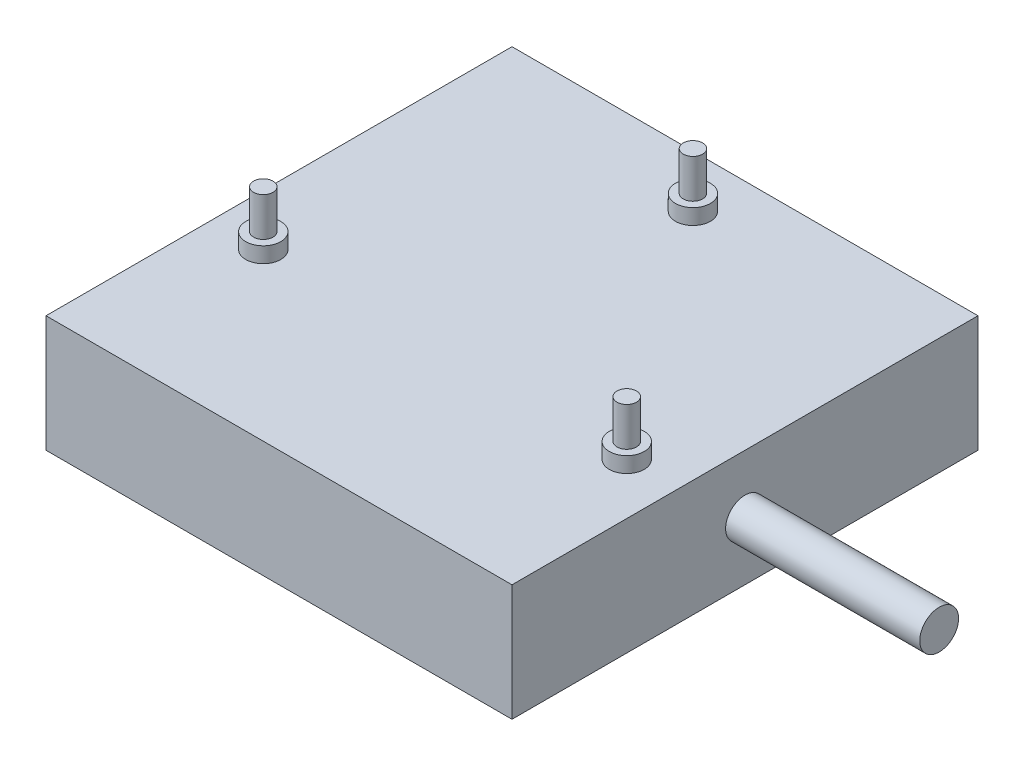
ISO-10303-21;
HEADER;
FILE_DESCRIPTION(('STEP AP214'),'2;1');
FILE_NAME('part.step','',(''),(''),'','','');
FILE_SCHEMA(('AUTOMOTIVE_DESIGN { 1 0 10303 214 1 1 1 1 }'));
ENDSEC;
DATA;
#1=APPLICATION_CONTEXT('core data for automotive mechanical design processes');
#2=APPLICATION_PROTOCOL_DEFINITION('international standard','automotive_design',2000,#1);
#3=PRODUCT_CONTEXT('',#1,'mechanical');
#4=PRODUCT('Part','Part','',(#3));
#5=PRODUCT_RELATED_PRODUCT_CATEGORY('part','',(#4));
#6=PRODUCT_DEFINITION_FORMATION('','',#4);
#7=PRODUCT_DEFINITION_CONTEXT('part definition',#1,'design');
#8=PRODUCT_DEFINITION('design','',#6,#7);
#9=PRODUCT_DEFINITION_SHAPE('','',#8);
#10=(LENGTH_UNIT() NAMED_UNIT(*) SI_UNIT(.MILLI.,.METRE.));
#11=(NAMED_UNIT(*) PLANE_ANGLE_UNIT() SI_UNIT($,.RADIAN.));
#12=(NAMED_UNIT(*) SI_UNIT($,.STERADIAN.) SOLID_ANGLE_UNIT());
#13=UNCERTAINTY_MEASURE_WITH_UNIT(LENGTH_MEASURE(1.E-05),#10,'distance_accuracy_value','');
#14=(GEOMETRIC_REPRESENTATION_CONTEXT(3) GLOBAL_UNCERTAINTY_ASSIGNED_CONTEXT((#13)) GLOBAL_UNIT_ASSIGNED_CONTEXT((#10,
#11,#12)) REPRESENTATION_CONTEXT('',''));
#15=CARTESIAN_POINT('',(0.,0.,0.));
#16=DIRECTION('',(0.,0.,1.));
#17=DIRECTION('',(1.,0.,0.));
#18=AXIS2_PLACEMENT_3D('',#15,#16,#17);
#19=CARTESIAN_POINT('',(30.,-15.,30.));
#20=DIRECTION('',(1.,0.,0.));
#21=DIRECTION('',(0.,0.,-1.));
#22=AXIS2_PLACEMENT_3D('',#19,#20,#21);
#23=PLANE('',#22);
#24=CARTESIAN_POINT('',(30.,-7.5,0.));
#25=DIRECTION('',(1.,0.,0.));
#26=DIRECTION('',(0.,0.,-1.));
#27=AXIS2_PLACEMENT_3D('',#24,#25,#26);
#28=CIRCLE('',#27,2.5);
#29=CARTESIAN_POINT('',(30.,-7.5,-2.5));
#30=VERTEX_POINT('',#29);
#31=EDGE_CURVE('E305',#30,#30,#28,.T.);
#32=ORIENTED_EDGE('',*,*,#31,.F.);
#33=EDGE_LOOP('',(#32));
#34=FACE_BOUND('',#33,.T.);
#35=DIRECTION('',(0.,0.,-1.));
#36=VECTOR('',#35,1.);
#37=CARTESIAN_POINT('',(30.,0.,30.));
#38=LINE('',#37,#36);
#39=CARTESIAN_POINT('',(30.,0.,30.));
#40=VERTEX_POINT('',#39);
#41=CARTESIAN_POINT('',(30.,0.,-30.));
#42=VERTEX_POINT('',#41);
#43=EDGE_CURVE('E201',#40,#42,#38,.T.);
#44=ORIENTED_EDGE('',*,*,#43,.F.);
#45=DIRECTION('',(0.,1.,0.));
#46=VECTOR('',#45,1.);
#47=CARTESIAN_POINT('',(30.,-15.,30.));
#48=LINE('',#47,#46);
#49=CARTESIAN_POINT('',(30.,-15.,30.));
#50=VERTEX_POINT('',#49);
#51=EDGE_CURVE('E66',#50,#40,#48,.T.);
#52=ORIENTED_EDGE('',*,*,#51,.F.);
#53=DIRECTION('',(0.,0.,-1.));
#54=VECTOR('',#53,1.);
#55=CARTESIAN_POINT('',(30.,-15.,30.));
#56=LINE('',#55,#54);
#57=CARTESIAN_POINT('',(30.,-15.,-30.));
#58=VERTEX_POINT('',#57);
#59=EDGE_CURVE('E213',#50,#58,#56,.T.);
#60=ORIENTED_EDGE('',*,*,#59,.T.);
#61=DIRECTION('',(0.,1.,0.));
#62=VECTOR('',#61,1.);
#63=CARTESIAN_POINT('',(30.,-15.,-30.));
#64=LINE('',#63,#62);
#65=EDGE_CURVE('E92',#58,#42,#64,.T.);
#66=ORIENTED_EDGE('',*,*,#65,.T.);
#67=EDGE_LOOP('',(#44,#52,#60,#66));
#68=FACE_BOUND('',#67,.T.);
#69=ADVANCED_FACE('F41',(#34,#68),#23,.T.);
#70=CARTESIAN_POINT('',(-30.,-15.,30.));
#71=DIRECTION('',(0.,0.,1.));
#72=DIRECTION('',(1.,0.,0.));
#73=AXIS2_PLACEMENT_3D('',#70,#71,#72);
#74=PLANE('',#73);
#75=DIRECTION('',(1.,0.,0.));
#76=VECTOR('',#75,1.);
#77=CARTESIAN_POINT('',(-30.,0.,30.));
#78=LINE('',#77,#76);
#79=CARTESIAN_POINT('',(-30.,0.,30.));
#80=VERTEX_POINT('',#79);
#81=EDGE_CURVE('E216',#80,#40,#78,.T.);
#82=ORIENTED_EDGE('',*,*,#81,.F.);
#83=DIRECTION('',(0.,1.,0.));
#84=VECTOR('',#83,1.);
#85=CARTESIAN_POINT('',(-30.,-15.,30.));
#86=LINE('',#85,#84);
#87=CARTESIAN_POINT('',(-30.,-15.,30.));
#88=VERTEX_POINT('',#87);
#89=EDGE_CURVE('E235',#88,#80,#86,.T.);
#90=ORIENTED_EDGE('',*,*,#89,.F.);
#91=DIRECTION('',(1.,0.,0.));
#92=VECTOR('',#91,1.);
#93=CARTESIAN_POINT('',(-30.,-15.,30.));
#94=LINE('',#93,#92);
#95=EDGE_CURVE('E221',#88,#50,#94,.T.);
#96=ORIENTED_EDGE('',*,*,#95,.T.);
#97=ORIENTED_EDGE('',*,*,#51,.T.);
#98=EDGE_LOOP('',(#82,#90,#96,#97));
#99=FACE_BOUND('',#98,.T.);
#100=ADVANCED_FACE('F294',(#99),#74,.T.);
#101=CARTESIAN_POINT('',(-30.,-15.,30.));
#102=DIRECTION('',(-1.,0.,0.));
#103=DIRECTION('',(0.,0.,1.));
#104=AXIS2_PLACEMENT_3D('',#101,#102,#103);
#105=PLANE('',#104);
#106=CARTESIAN_POINT('',(-30.,-7.5,16.));
#107=DIRECTION('',(-1.,0.,0.));
#108=DIRECTION('',(0.,0.,1.));
#109=AXIS2_PLACEMENT_3D('',#106,#107,#108);
#110=CIRCLE('',#109,3.);
#111=CARTESIAN_POINT('',(-30.,-10.4692494924058,16.4284360533937));
#112=VERTEX_POINT('',#111);
#113=CARTESIAN_POINT('',(-30.,-4.53075050759416,16.4284360533938));
#114=VERTEX_POINT('',#113);
#115=EDGE_CURVE('E57',#112,#114,#110,.T.);
#116=ORIENTED_EDGE('',*,*,#115,.F.);
#117=DIRECTION('',(0.,0.142812017797916,0.98974983080195));
#118=VECTOR('',#117,1.);
#119=CARTESIAN_POINT('',(-30.,-12.5778556764311,1.81487169062374));
#120=LINE('',#119,#118);
#121=CARTESIAN_POINT('',(-30.,-12.1904157598234,4.5));
#122=VERTEX_POINT('',#121);
#123=EDGE_CURVE('E161',#122,#112,#120,.T.);
#124=ORIENTED_EDGE('',*,*,#123,.F.);
#125=CARTESIAN_POINT('',(-30.,-7.5,0.));
#126=DIRECTION('',(-1.,0.,0.));
#127=DIRECTION('',(0.,0.,1.));
#128=AXIS2_PLACEMENT_3D('',#125,#126,#127);
#129=CIRCLE('',#128,6.5);
#130=CARTESIAN_POINT('',(-30.,-12.1904157598234,-4.5));
#131=VERTEX_POINT('',#130);
#132=EDGE_CURVE('E164',#131,#122,#129,.T.);
#133=ORIENTED_EDGE('',*,*,#132,.F.);
#134=DIRECTION('',(0.,0.142812017797917,-0.98974983080195));
#135=VECTOR('',#134,1.);
#136=CARTESIAN_POINT('',(-30.,-12.5778556764311,-1.81487169062374));
#137=LINE('',#136,#135);
#138=CARTESIAN_POINT('',(-30.,-10.4692494924058,-16.4284360533937));
#139=VERTEX_POINT('',#138);
#140=EDGE_CURVE('E194',#131,#139,#137,.T.);
#141=ORIENTED_EDGE('',*,*,#140,.T.);
#142=CARTESIAN_POINT('',(-30.,-7.5,-16.));
#143=DIRECTION('',(-1.,0.,0.));
#144=DIRECTION('',(0.,0.,1.));
#145=AXIS2_PLACEMENT_3D('',#142,#143,#144);
#146=CIRCLE('',#145,3.);
#147=CARTESIAN_POINT('',(-30.,-4.53075050759416,-16.4284360533938));
#148=VERTEX_POINT('',#147);
#149=EDGE_CURVE('E191',#148,#139,#146,.T.);
#150=ORIENTED_EDGE('',*,*,#149,.F.);
#151=DIRECTION('',(0.,0.142812017797916,0.98974983080195));
#152=VECTOR('',#151,1.);
#153=CARTESIAN_POINT('',(-30.,-2.11621523715625,0.305350866155849));
#154=LINE('',#153,#152);
#155=CARTESIAN_POINT('',(-30.,-2.80958424017657,-4.5));
#156=VERTEX_POINT('',#155);
#157=EDGE_CURVE('E188',#148,#156,#154,.T.);
#158=ORIENTED_EDGE('',*,*,#157,.T.);
#159=CARTESIAN_POINT('',(-30.,-7.5,0.));
#160=DIRECTION('',(-1.,0.,0.));
#161=DIRECTION('',(0.,0.,1.));
#162=AXIS2_PLACEMENT_3D('',#159,#160,#161);
#163=CIRCLE('',#162,6.5);
#164=CARTESIAN_POINT('',(-30.,-2.80958424017657,4.5));
#165=VERTEX_POINT('',#164);
#166=EDGE_CURVE('E185',#165,#156,#163,.T.);
#167=ORIENTED_EDGE('',*,*,#166,.F.);
#168=DIRECTION('',(0.,-0.142812017797916,0.98974983080195));
#169=VECTOR('',#168,1.);
#170=CARTESIAN_POINT('',(-30.,-2.11621523715625,-0.305350866155848));
#171=LINE('',#170,#169);
#172=EDGE_CURVE('E182',#165,#114,#171,.T.);
#173=ORIENTED_EDGE('',*,*,#172,.T.);
#174=EDGE_LOOP('',(#116,#124,#133,#141,#150,#158,#167,#173));
#175=FACE_BOUND('',#174,.T.);
#176=DIRECTION('',(0.,0.,1.));
#177=VECTOR('',#176,1.);
#178=CARTESIAN_POINT('',(-30.,0.,30.));
#179=LINE('',#178,#177);
#180=CARTESIAN_POINT('',(-30.,0.,-30.));
#181=VERTEX_POINT('',#180);
#182=EDGE_CURVE('E228',#181,#80,#179,.T.);
#183=ORIENTED_EDGE('',*,*,#182,.F.);
#184=DIRECTION('',(0.,1.,0.));
#185=VECTOR('',#184,1.);
#186=CARTESIAN_POINT('',(-30.,-15.,-30.));
#187=LINE('',#186,#185);
#188=CARTESIAN_POINT('',(-30.,-15.,-30.));
#189=VERTEX_POINT('',#188);
#190=EDGE_CURVE('E237',#189,#181,#187,.T.);
#191=ORIENTED_EDGE('',*,*,#190,.F.);
#192=DIRECTION('',(0.,0.,1.));
#193=VECTOR('',#192,1.);
#194=CARTESIAN_POINT('',(-30.,-15.,30.));
#195=LINE('',#194,#193);
#196=EDGE_CURVE('E218',#189,#88,#195,.T.);
#197=ORIENTED_EDGE('',*,*,#196,.T.);
#198=ORIENTED_EDGE('',*,*,#89,.T.);
#199=EDGE_LOOP('',(#183,#191,#197,#198));
#200=FACE_BOUND('',#199,.T.);
#201=ADVANCED_FACE('F301',(#175,#200),#105,.T.);
#202=CARTESIAN_POINT('',(-30.,-15.,-30.));
#203=DIRECTION('',(0.,0.,-1.));
#204=DIRECTION('',(-1.,0.,0.));
#205=AXIS2_PLACEMENT_3D('',#202,#203,#204);
#206=PLANE('',#205);
#207=DIRECTION('',(-1.,0.,0.));
#208=VECTOR('',#207,1.);
#209=CARTESIAN_POINT('',(-30.,0.,-30.));
#210=LINE('',#209,#208);
#211=EDGE_CURVE('E225',#42,#181,#210,.T.);
#212=ORIENTED_EDGE('',*,*,#211,.F.);
#213=ORIENTED_EDGE('',*,*,#65,.F.);
#214=DIRECTION('',(-1.,0.,0.));
#215=VECTOR('',#214,1.);
#216=CARTESIAN_POINT('',(-30.,-15.,-30.));
#217=LINE('',#216,#215);
#218=EDGE_CURVE('E215',#58,#189,#217,.T.);
#219=ORIENTED_EDGE('',*,*,#218,.T.);
#220=ORIENTED_EDGE('',*,*,#190,.T.);
#221=EDGE_LOOP('',(#212,#213,#219,#220));
#222=FACE_BOUND('',#221,.T.);
#223=ADVANCED_FACE('F314',(#222),#206,.T.);
#224=CARTESIAN_POINT('',(0.,-15.,0.));
#225=DIRECTION('',(0.,-1.,0.));
#226=DIRECTION('',(0.,0.,-1.));
#227=AXIS2_PLACEMENT_3D('',#224,#225,#226);
#228=PLANE('',#227);
#229=ORIENTED_EDGE('',*,*,#59,.F.);
#230=ORIENTED_EDGE('',*,*,#95,.F.);
#231=ORIENTED_EDGE('',*,*,#196,.F.);
#232=ORIENTED_EDGE('',*,*,#218,.F.);
#233=EDGE_LOOP('',(#229,#230,#231,#232));
#234=FACE_BOUND('',#233,.T.);
#235=ADVANCED_FACE('F313',(#234),#228,.T.);
#236=CARTESIAN_POINT('',(0.,0.,0.));
#237=DIRECTION('',(0.,-1.,0.));
#238=DIRECTION('',(0.,0.,-1.));
#239=AXIS2_PLACEMENT_3D('',#236,#237,#238);
#240=PLANE('',#239);
#241=CARTESIAN_POINT('',(-23.4,0.,8.623991148451));
#242=DIRECTION('',(0.,-1.,0.));
#243=DIRECTION('',(0.,0.,-1.));
#244=AXIS2_PLACEMENT_3D('',#241,#242,#243);
#245=CIRCLE('',#244,2.25);
#246=CARTESIAN_POINT('',(-23.4,0.,6.373991148451));
#247=VERTEX_POINT('',#246);
#248=EDGE_CURVE('E44',#247,#247,#245,.F.);
#249=ORIENTED_EDGE('',*,*,#248,.F.);
#250=EDGE_LOOP('',(#249));
#251=FACE_BOUND('',#250,.T.);
#252=CARTESIAN_POINT('',(0.,0.,-23.296008851549));
#253=DIRECTION('',(0.,-1.,0.));
#254=DIRECTION('',(0.,0.,-1.));
#255=AXIS2_PLACEMENT_3D('',#252,#253,#254);
#256=CIRCLE('',#255,2.25000000000001);
#257=CARTESIAN_POINT('',(0.,0.,-25.546008851549));
#258=VERTEX_POINT('',#257);
#259=EDGE_CURVE('E241',#258,#258,#256,.F.);
#260=ORIENTED_EDGE('',*,*,#259,.F.);
#261=EDGE_LOOP('',(#260));
#262=FACE_BOUND('',#261,.T.);
#263=CARTESIAN_POINT('',(23.4,0.,8.62399114845105));
#264=DIRECTION('',(0.,-1.,0.));
#265=DIRECTION('',(0.,0.,-1.));
#266=AXIS2_PLACEMENT_3D('',#263,#264,#265);
#267=CIRCLE('',#266,2.25000000000002);
#268=CARTESIAN_POINT('',(23.4,0.,6.37399114845103));
#269=VERTEX_POINT('',#268);
#270=EDGE_CURVE('E234',#269,#269,#267,.F.);
#271=ORIENTED_EDGE('',*,*,#270,.F.);
#272=EDGE_LOOP('',(#271));
#273=FACE_BOUND('',#272,.T.);
#274=ORIENTED_EDGE('',*,*,#43,.T.);
#275=ORIENTED_EDGE('',*,*,#211,.T.);
#276=ORIENTED_EDGE('',*,*,#182,.T.);
#277=ORIENTED_EDGE('',*,*,#81,.T.);
#278=EDGE_LOOP('',(#274,#275,#276,#277));
#279=FACE_BOUND('',#278,.T.);
#280=ADVANCED_FACE('F307',(#251,#262,#273,#279),#240,.F.);
#281=CARTESIAN_POINT('',(-27.,-7.5,16.));
#282=DIRECTION('',(-1.,0.,0.));
#283=DIRECTION('',(0.,0.,1.));
#284=AXIS2_PLACEMENT_3D('',#281,#282,#283);
#285=CYLINDRICAL_SURFACE('',#284,3.);
#286=ORIENTED_EDGE('',*,*,#115,.T.);
#287=DIRECTION('',(-1.,0.,0.));
#288=VECTOR('',#287,1.);
#289=CARTESIAN_POINT('',(-27.,-4.53075050759415,16.4284360533938));
#290=LINE('',#289,#288);
#291=CARTESIAN_POINT('',(-27.,-4.53075050759415,16.4284360533938));
#292=VERTEX_POINT('',#291);
#293=EDGE_CURVE('E143',#292,#114,#290,.T.);
#294=ORIENTED_EDGE('',*,*,#293,.F.);
#295=CARTESIAN_POINT('',(-27.,-7.5,16.));
#296=DIRECTION('',(-1.,0.,0.));
#297=DIRECTION('',(0.,0.,1.));
#298=AXIS2_PLACEMENT_3D('',#295,#296,#297);
#299=CIRCLE('',#298,3.);
#300=CARTESIAN_POINT('',(-27.,-10.4692494924058,16.4284360533937));
#301=VERTEX_POINT('',#300);
#302=EDGE_CURVE('E151',#301,#292,#299,.T.);
#303=ORIENTED_EDGE('',*,*,#302,.F.);
#304=DIRECTION('',(-1.,0.,0.));
#305=VECTOR('',#304,1.);
#306=CARTESIAN_POINT('',(-27.,-10.4692494924058,16.4284360533937));
#307=LINE('',#306,#305);
#308=EDGE_CURVE('E199',#301,#112,#307,.T.);
#309=ORIENTED_EDGE('',*,*,#308,.T.);
#310=EDGE_LOOP('',(#286,#294,#303,#309));
#311=FACE_BOUND('',#310,.T.);
#312=ADVANCED_FACE('F154',(#311),#285,.F.);
#313=CARTESIAN_POINT('',(-27.,-12.5778556764311,1.81487169062374));
#314=DIRECTION('',(0.,-0.989749830801949,0.142812017797916));
#315=DIRECTION('',(0.,-0.142812017797916,-0.98974983080195));
#316=AXIS2_PLACEMENT_3D('',#313,#314,#315);
#317=PLANE('',#316);
#318=ORIENTED_EDGE('',*,*,#123,.T.);
#319=ORIENTED_EDGE('',*,*,#308,.F.);
#320=DIRECTION('',(0.,0.142812017797916,0.98974983080195));
#321=VECTOR('',#320,1.);
#322=CARTESIAN_POINT('',(-27.,-12.5778556764311,1.81487169062374));
#323=LINE('',#322,#321);
#324=CARTESIAN_POINT('',(-27.,-12.1904157598234,4.5));
#325=VERTEX_POINT('',#324);
#326=EDGE_CURVE('E156',#325,#301,#323,.T.);
#327=ORIENTED_EDGE('',*,*,#326,.F.);
#328=DIRECTION('',(-1.,0.,0.));
#329=VECTOR('',#328,1.);
#330=CARTESIAN_POINT('',(-27.,-12.1904157598234,4.5));
#331=LINE('',#330,#329);
#332=EDGE_CURVE('E202',#325,#122,#331,.T.);
#333=ORIENTED_EDGE('',*,*,#332,.T.);
#334=EDGE_LOOP('',(#318,#319,#327,#333));
#335=FACE_BOUND('',#334,.T.);
#336=ADVANCED_FACE('F329',(#335),#317,.F.);
#337=CARTESIAN_POINT('',(-27.,-7.5,0.));
#338=DIRECTION('',(-1.,0.,0.));
#339=DIRECTION('',(0.,0.,1.));
#340=AXIS2_PLACEMENT_3D('',#337,#338,#339);
#341=CYLINDRICAL_SURFACE('',#340,6.5);
#342=ORIENTED_EDGE('',*,*,#132,.T.);
#343=ORIENTED_EDGE('',*,*,#332,.F.);
#344=CARTESIAN_POINT('',(-27.,-7.5,0.));
#345=DIRECTION('',(-1.,0.,0.));
#346=DIRECTION('',(0.,0.,1.));
#347=AXIS2_PLACEMENT_3D('',#344,#345,#346);
#348=CIRCLE('',#347,6.5);
#349=CARTESIAN_POINT('',(-27.,-12.1904157598234,-4.5));
#350=VERTEX_POINT('',#349);
#351=EDGE_CURVE('E178',#350,#325,#348,.T.);
#352=ORIENTED_EDGE('',*,*,#351,.F.);
#353=DIRECTION('',(-1.,0.,0.));
#354=VECTOR('',#353,1.);
#355=CARTESIAN_POINT('',(-27.,-12.1904157598234,-4.5));
#356=LINE('',#355,#354);
#357=EDGE_CURVE('E204',#350,#131,#356,.T.);
#358=ORIENTED_EDGE('',*,*,#357,.T.);
#359=EDGE_LOOP('',(#342,#343,#352,#358));
#360=FACE_BOUND('',#359,.T.);
#361=ADVANCED_FACE('F347',(#360),#341,.F.);
#362=CARTESIAN_POINT('',(-27.,-12.5778556764311,-1.81487169062374));
#363=DIRECTION('',(0.,0.989749830801949,0.142812017797916));
#364=DIRECTION('',(0.,-0.142812017797917,0.98974983080195));
#365=AXIS2_PLACEMENT_3D('',#362,#363,#364);
#366=PLANE('',#365);
#367=ORIENTED_EDGE('',*,*,#140,.F.);
#368=ORIENTED_EDGE('',*,*,#357,.F.);
#369=DIRECTION('',(0.,0.142812017797917,-0.98974983080195));
#370=VECTOR('',#369,1.);
#371=CARTESIAN_POINT('',(-27.,-12.5778556764311,-1.81487169062374));
#372=LINE('',#371,#370);
#373=CARTESIAN_POINT('',(-27.,-10.4692494924058,-16.4284360533937));
#374=VERTEX_POINT('',#373);
#375=EDGE_CURVE('E176',#350,#374,#372,.T.);
#376=ORIENTED_EDGE('',*,*,#375,.T.);
#377=DIRECTION('',(-1.,0.,0.));
#378=VECTOR('',#377,1.);
#379=CARTESIAN_POINT('',(-27.,-10.4692494924058,-16.4284360533937));
#380=LINE('',#379,#378);
#381=EDGE_CURVE('E206',#374,#139,#380,.T.);
#382=ORIENTED_EDGE('',*,*,#381,.T.);
#383=EDGE_LOOP('',(#367,#368,#376,#382));
#384=FACE_BOUND('',#383,.T.);
#385=ADVANCED_FACE('F343',(#384),#366,.T.);
#386=CARTESIAN_POINT('',(-27.,-7.5,-16.));
#387=DIRECTION('',(-1.,0.,0.));
#388=DIRECTION('',(0.,0.,1.));
#389=AXIS2_PLACEMENT_3D('',#386,#387,#388);
#390=CYLINDRICAL_SURFACE('',#389,3.);
#391=ORIENTED_EDGE('',*,*,#149,.T.);
#392=ORIENTED_EDGE('',*,*,#381,.F.);
#393=CARTESIAN_POINT('',(-27.,-7.5,-16.));
#394=DIRECTION('',(-1.,0.,0.));
#395=DIRECTION('',(0.,0.,1.));
#396=AXIS2_PLACEMENT_3D('',#393,#394,#395);
#397=CIRCLE('',#396,3.);
#398=CARTESIAN_POINT('',(-27.,-4.53075050759416,-16.4284360533938));
#399=VERTEX_POINT('',#398);
#400=EDGE_CURVE('E173',#399,#374,#397,.T.);
#401=ORIENTED_EDGE('',*,*,#400,.F.);
#402=DIRECTION('',(-1.,0.,0.));
#403=VECTOR('',#402,1.);
#404=CARTESIAN_POINT('',(-27.,-4.53075050759416,-16.4284360533938));
#405=LINE('',#404,#403);
#406=EDGE_CURVE('E208',#399,#148,#405,.T.);
#407=ORIENTED_EDGE('',*,*,#406,.T.);
#408=EDGE_LOOP('',(#391,#392,#401,#407));
#409=FACE_BOUND('',#408,.T.);
#410=ADVANCED_FACE('F339',(#409),#390,.F.);
#411=CARTESIAN_POINT('',(-27.,-2.11621523715625,0.305350866155849));
#412=DIRECTION('',(0.,-0.989749830801949,0.142812017797916));
#413=DIRECTION('',(0.,-0.142812017797916,-0.98974983080195));
#414=AXIS2_PLACEMENT_3D('',#411,#412,#413);
#415=PLANE('',#414);
#416=ORIENTED_EDGE('',*,*,#157,.F.);
#417=ORIENTED_EDGE('',*,*,#406,.F.);
#418=DIRECTION('',(0.,0.142812017797916,0.98974983080195));
#419=VECTOR('',#418,1.);
#420=CARTESIAN_POINT('',(-27.,-2.11621523715625,0.305350866155849));
#421=LINE('',#420,#419);
#422=CARTESIAN_POINT('',(-27.,-2.80958424017657,-4.5));
#423=VERTEX_POINT('',#422);
#424=EDGE_CURVE('E171',#399,#423,#421,.T.);
#425=ORIENTED_EDGE('',*,*,#424,.T.);
#426=DIRECTION('',(-1.,0.,0.));
#427=VECTOR('',#426,1.);
#428=CARTESIAN_POINT('',(-27.,-2.80958424017657,-4.5));
#429=LINE('',#428,#427);
#430=EDGE_CURVE('E210',#423,#156,#429,.T.);
#431=ORIENTED_EDGE('',*,*,#430,.T.);
#432=EDGE_LOOP('',(#416,#417,#425,#431));
#433=FACE_BOUND('',#432,.T.);
#434=ADVANCED_FACE('F335',(#433),#415,.T.);
#435=CARTESIAN_POINT('',(-27.,-7.5,0.));
#436=DIRECTION('',(-1.,0.,0.));
#437=DIRECTION('',(0.,0.,1.));
#438=AXIS2_PLACEMENT_3D('',#435,#436,#437);
#439=CYLINDRICAL_SURFACE('',#438,6.5);
#440=ORIENTED_EDGE('',*,*,#166,.T.);
#441=ORIENTED_EDGE('',*,*,#430,.F.);
#442=CARTESIAN_POINT('',(-27.,-7.5,0.));
#443=DIRECTION('',(-1.,0.,0.));
#444=DIRECTION('',(0.,0.,1.));
#445=AXIS2_PLACEMENT_3D('',#442,#443,#444);
#446=CIRCLE('',#445,6.5);
#447=CARTESIAN_POINT('',(-27.,-2.80958424017657,4.5));
#448=VERTEX_POINT('',#447);
#449=EDGE_CURVE('E150',#448,#423,#446,.T.);
#450=ORIENTED_EDGE('',*,*,#449,.F.);
#451=DIRECTION('',(-1.,0.,0.));
#452=VECTOR('',#451,1.);
#453=CARTESIAN_POINT('',(-27.,-2.80958424017657,4.5));
#454=LINE('',#453,#452);
#455=EDGE_CURVE('E145',#448,#165,#454,.T.);
#456=ORIENTED_EDGE('',*,*,#455,.T.);
#457=EDGE_LOOP('',(#440,#441,#450,#456));
#458=FACE_BOUND('',#457,.T.);
#459=ADVANCED_FACE('F332',(#458),#439,.F.);
#460=CARTESIAN_POINT('',(-27.,-2.11621523715625,-0.305350866155848));
#461=DIRECTION('',(0.,-0.989749830801949,-0.142812017797916));
#462=DIRECTION('',(0.,0.142812017797916,-0.98974983080195));
#463=AXIS2_PLACEMENT_3D('',#460,#461,#462);
#464=PLANE('',#463);
#465=ORIENTED_EDGE('',*,*,#172,.F.);
#466=ORIENTED_EDGE('',*,*,#455,.F.);
#467=DIRECTION('',(0.,-0.142812017797916,0.98974983080195));
#468=VECTOR('',#467,1.);
#469=CARTESIAN_POINT('',(-27.,-2.11621523715625,-0.305350866155848));
#470=LINE('',#469,#468);
#471=EDGE_CURVE('E140',#448,#292,#470,.T.);
#472=ORIENTED_EDGE('',*,*,#471,.T.);
#473=ORIENTED_EDGE('',*,*,#293,.T.);
#474=EDGE_LOOP('',(#465,#466,#472,#473));
#475=FACE_BOUND('',#474,.T.);
#476=ADVANCED_FACE('F142',(#475),#464,.T.);
#477=CARTESIAN_POINT('',(-27.,0.,0.));
#478=DIRECTION('',(-1.,0.,0.));
#479=DIRECTION('',(0.,0.,1.));
#480=AXIS2_PLACEMENT_3D('',#477,#478,#479);
#481=PLANE('',#480);
#482=ORIENTED_EDGE('',*,*,#302,.T.);
#483=ORIENTED_EDGE('',*,*,#471,.F.);
#484=ORIENTED_EDGE('',*,*,#449,.T.);
#485=ORIENTED_EDGE('',*,*,#424,.F.);
#486=ORIENTED_EDGE('',*,*,#400,.T.);
#487=ORIENTED_EDGE('',*,*,#375,.F.);
#488=ORIENTED_EDGE('',*,*,#351,.T.);
#489=ORIENTED_EDGE('',*,*,#326,.T.);
#490=EDGE_LOOP('',(#482,#483,#484,#485,#486,#487,#488,#489));
#491=FACE_BOUND('',#490,.T.);
#492=ADVANCED_FACE('F158',(#491),#481,.T.);
#493=CARTESIAN_POINT('',(23.4,2.,8.62399114845105));
#494=DIRECTION('',(0.,-1.,0.));
#495=DIRECTION('',(0.,0.,-1.));
#496=AXIS2_PLACEMENT_3D('',#493,#494,#495);
#497=CYLINDRICAL_SURFACE('',#496,2.25000000000002);
#498=CARTESIAN_POINT('',(23.4,2.,8.62399114845105));
#499=DIRECTION('',(0.,1.,0.));
#500=DIRECTION('',(0.,0.,1.));
#501=AXIS2_PLACEMENT_3D('',#498,#499,#500);
#502=CIRCLE('',#501,2.25000000000002);
#503=CARTESIAN_POINT('',(23.4,2.,10.8739911484511));
#504=VERTEX_POINT('',#503);
#505=EDGE_CURVE('E167',#504,#504,#502,.T.);
#506=ORIENTED_EDGE('',*,*,#505,.F.);
#507=EDGE_LOOP('',(#506));
#508=FACE_BOUND('',#507,.T.);
#509=ORIENTED_EDGE('',*,*,#270,.T.);
#510=EDGE_LOOP('',(#509));
#511=FACE_BOUND('',#510,.T.);
#512=ADVANCED_FACE('F357',(#508,#511),#497,.T.);
#513=CARTESIAN_POINT('',(0.,2.,0.));
#514=DIRECTION('',(0.,1.,0.));
#515=DIRECTION('',(0.,0.,1.));
#516=AXIS2_PLACEMENT_3D('',#513,#514,#515);
#517=PLANE('',#516);
#518=CARTESIAN_POINT('',(23.4,2.,8.62399114845105));
#519=DIRECTION('',(0.,1.,0.));
#520=DIRECTION('',(0.,0.,1.));
#521=AXIS2_PLACEMENT_3D('',#518,#519,#520);
#522=CIRCLE('',#521,1.25);
#523=CARTESIAN_POINT('',(23.4,2.,9.87399114845105));
#524=VERTEX_POINT('',#523);
#525=EDGE_CURVE('E11',#524,#524,#522,.T.);
#526=ORIENTED_EDGE('',*,*,#525,.F.);
#527=EDGE_LOOP('',(#526));
#528=FACE_BOUND('',#527,.T.);
#529=ORIENTED_EDGE('',*,*,#505,.T.);
#530=EDGE_LOOP('',(#529));
#531=FACE_BOUND('',#530,.T.);
#532=ADVANCED_FACE('F360',(#528,#531),#517,.T.);
#533=CARTESIAN_POINT('',(0.,2.,-23.296008851549));
#534=DIRECTION('',(0.,-1.,0.));
#535=DIRECTION('',(0.,0.,-1.));
#536=AXIS2_PLACEMENT_3D('',#533,#534,#535);
#537=CYLINDRICAL_SURFACE('',#536,2.25000000000001);
#538=CARTESIAN_POINT('',(0.,2.,-23.296008851549));
#539=DIRECTION('',(0.,1.,0.));
#540=DIRECTION('',(0.,0.,1.));
#541=AXIS2_PLACEMENT_3D('',#538,#539,#540);
#542=CIRCLE('',#541,2.25000000000001);
#543=CARTESIAN_POINT('',(0.,2.,-21.046008851549));
#544=VERTEX_POINT('',#543);
#545=EDGE_CURVE('E267',#544,#544,#542,.T.);
#546=ORIENTED_EDGE('',*,*,#545,.F.);
#547=EDGE_LOOP('',(#546));
#548=FACE_BOUND('',#547,.T.);
#549=ORIENTED_EDGE('',*,*,#259,.T.);
#550=EDGE_LOOP('',(#549));
#551=FACE_BOUND('',#550,.T.);
#552=ADVANCED_FACE('F364',(#548,#551),#537,.T.);
#553=CARTESIAN_POINT('',(0.,2.,0.));
#554=DIRECTION('',(0.,1.,0.));
#555=DIRECTION('',(0.,0.,1.));
#556=AXIS2_PLACEMENT_3D('',#553,#554,#555);
#557=PLANE('',#556);
#558=CARTESIAN_POINT('',(0.,2.,-23.296008851549));
#559=DIRECTION('',(0.,1.,0.));
#560=DIRECTION('',(0.,0.,1.));
#561=AXIS2_PLACEMENT_3D('',#558,#559,#560);
#562=CIRCLE('',#561,1.25);
#563=CARTESIAN_POINT('',(0.,2.,-22.046008851549));
#564=VERTEX_POINT('',#563);
#565=EDGE_CURVE('E49',#564,#564,#562,.T.);
#566=ORIENTED_EDGE('',*,*,#565,.F.);
#567=EDGE_LOOP('',(#566));
#568=FACE_BOUND('',#567,.T.);
#569=ORIENTED_EDGE('',*,*,#545,.T.);
#570=EDGE_LOOP('',(#569));
#571=FACE_BOUND('',#570,.T.);
#572=ADVANCED_FACE('F368',(#568,#571),#557,.T.);
#573=CARTESIAN_POINT('',(-23.4,2.,8.623991148451));
#574=DIRECTION('',(0.,-1.,0.));
#575=DIRECTION('',(0.,0.,-1.));
#576=AXIS2_PLACEMENT_3D('',#573,#574,#575);
#577=CYLINDRICAL_SURFACE('',#576,2.25);
#578=CARTESIAN_POINT('',(-23.4,2.,8.623991148451));
#579=DIRECTION('',(0.,1.,0.));
#580=DIRECTION('',(0.,0.,1.));
#581=AXIS2_PLACEMENT_3D('',#578,#579,#580);
#582=CIRCLE('',#581,2.25);
#583=CARTESIAN_POINT('',(-23.4,2.,10.873991148451));
#584=VERTEX_POINT('',#583);
#585=EDGE_CURVE('E183',#584,#584,#582,.T.);
#586=ORIENTED_EDGE('',*,*,#585,.F.);
#587=EDGE_LOOP('',(#586));
#588=FACE_BOUND('',#587,.T.);
#589=ORIENTED_EDGE('',*,*,#248,.T.);
#590=EDGE_LOOP('',(#589));
#591=FACE_BOUND('',#590,.T.);
#592=ADVANCED_FACE('F289',(#588,#591),#577,.T.);
#593=CARTESIAN_POINT('',(0.,2.,0.));
#594=DIRECTION('',(0.,1.,0.));
#595=DIRECTION('',(0.,0.,1.));
#596=AXIS2_PLACEMENT_3D('',#593,#594,#595);
#597=PLANE('',#596);
#598=CARTESIAN_POINT('',(-23.4,2.,8.623991148451));
#599=DIRECTION('',(0.,1.,0.));
#600=DIRECTION('',(0.,0.,1.));
#601=AXIS2_PLACEMENT_3D('',#598,#599,#600);
#602=CIRCLE('',#601,1.25);
#603=CARTESIAN_POINT('',(-23.4,2.,9.873991148451));
#604=VERTEX_POINT('',#603);
#605=EDGE_CURVE('E246',#604,#604,#602,.T.);
#606=ORIENTED_EDGE('',*,*,#605,.F.);
#607=EDGE_LOOP('',(#606));
#608=FACE_BOUND('',#607,.T.);
#609=ORIENTED_EDGE('',*,*,#585,.T.);
#610=EDGE_LOOP('',(#609));
#611=FACE_BOUND('',#610,.T.);
#612=ADVANCED_FACE('F281',(#608,#611),#597,.T.);
#613=CARTESIAN_POINT('',(-23.4,7.,8.623991148451));
#614=DIRECTION('',(0.,-1.,0.));
#615=DIRECTION('',(0.,0.,-1.));
#616=AXIS2_PLACEMENT_3D('',#613,#614,#615);
#617=CYLINDRICAL_SURFACE('',#616,1.25);
#618=CARTESIAN_POINT('',(-23.4,7.,8.623991148451));
#619=DIRECTION('',(0.,1.,0.));
#620=DIRECTION('',(0.,0.,1.));
#621=AXIS2_PLACEMENT_3D('',#618,#619,#620);
#622=CIRCLE('',#621,1.25);
#623=CARTESIAN_POINT('',(-23.4,7.,9.873991148451));
#624=VERTEX_POINT('',#623);
#625=EDGE_CURVE('E256',#624,#624,#622,.T.);
#626=ORIENTED_EDGE('',*,*,#625,.F.);
#627=EDGE_LOOP('',(#626));
#628=FACE_BOUND('',#627,.T.);
#629=ORIENTED_EDGE('',*,*,#605,.T.);
#630=EDGE_LOOP('',(#629));
#631=FACE_BOUND('',#630,.T.);
#632=ADVANCED_FACE('F279',(#628,#631),#617,.T.);
#633=CARTESIAN_POINT('',(-23.4,7.,8.623991148451));
#634=DIRECTION('',(0.,1.,0.));
#635=DIRECTION('',(0.,0.,1.));
#636=AXIS2_PLACEMENT_3D('',#633,#634,#635);
#637=PLANE('',#636);
#638=ORIENTED_EDGE('',*,*,#625,.T.);
#639=EDGE_LOOP('',(#638));
#640=FACE_BOUND('',#639,.T.);
#641=ADVANCED_FACE('F277',(#640),#637,.T.);
#642=CARTESIAN_POINT('',(0.,7.,-23.296008851549));
#643=DIRECTION('',(0.,-1.,0.));
#644=DIRECTION('',(0.,0.,-1.));
#645=AXIS2_PLACEMENT_3D('',#642,#643,#644);
#646=CYLINDRICAL_SURFACE('',#645,1.25);
#647=CARTESIAN_POINT('',(0.,7.,-23.296008851549));
#648=DIRECTION('',(0.,1.,0.));
#649=DIRECTION('',(0.,0.,1.));
#650=AXIS2_PLACEMENT_3D('',#647,#648,#649);
#651=CIRCLE('',#650,1.25);
#652=CARTESIAN_POINT('',(0.,7.,-22.046008851549));
#653=VERTEX_POINT('',#652);
#654=EDGE_CURVE('E259',#653,#653,#651,.T.);
#655=ORIENTED_EDGE('',*,*,#654,.F.);
#656=EDGE_LOOP('',(#655));
#657=FACE_BOUND('',#656,.T.);
#658=ORIENTED_EDGE('',*,*,#565,.T.);
#659=EDGE_LOOP('',(#658));
#660=FACE_BOUND('',#659,.T.);
#661=ADVANCED_FACE('F287',(#657,#660),#646,.T.);
#662=CARTESIAN_POINT('',(0.,7.,-23.296008851549));
#663=DIRECTION('',(0.,1.,0.));
#664=DIRECTION('',(0.,0.,1.));
#665=AXIS2_PLACEMENT_3D('',#662,#663,#664);
#666=PLANE('',#665);
#667=ORIENTED_EDGE('',*,*,#654,.T.);
#668=EDGE_LOOP('',(#667));
#669=FACE_BOUND('',#668,.T.);
#670=ADVANCED_FACE('F383',(#669),#666,.T.);
#671=CARTESIAN_POINT('',(23.4,7.,8.62399114845105));
#672=DIRECTION('',(0.,-1.,0.));
#673=DIRECTION('',(0.,0.,-1.));
#674=AXIS2_PLACEMENT_3D('',#671,#672,#673);
#675=CYLINDRICAL_SURFACE('',#674,1.25);
#676=CARTESIAN_POINT('',(23.4,7.,8.62399114845105));
#677=DIRECTION('',(0.,1.,0.));
#678=DIRECTION('',(0.,0.,1.));
#679=AXIS2_PLACEMENT_3D('',#676,#677,#678);
#680=CIRCLE('',#679,1.25);
#681=CARTESIAN_POINT('',(23.4,7.,9.87399114845105));
#682=VERTEX_POINT('',#681);
#683=EDGE_CURVE('E261',#682,#682,#680,.T.);
#684=ORIENTED_EDGE('',*,*,#683,.F.);
#685=EDGE_LOOP('',(#684));
#686=FACE_BOUND('',#685,.T.);
#687=ORIENTED_EDGE('',*,*,#525,.T.);
#688=EDGE_LOOP('',(#687));
#689=FACE_BOUND('',#688,.T.);
#690=ADVANCED_FACE('F379',(#686,#689),#675,.T.);
#691=CARTESIAN_POINT('',(23.4,7.,8.62399114845105));
#692=DIRECTION('',(0.,1.,0.));
#693=DIRECTION('',(0.,0.,1.));
#694=AXIS2_PLACEMENT_3D('',#691,#692,#693);
#695=PLANE('',#694);
#696=ORIENTED_EDGE('',*,*,#683,.T.);
#697=EDGE_LOOP('',(#696));
#698=FACE_BOUND('',#697,.T.);
#699=ADVANCED_FACE('F376',(#698),#695,.T.);
#700=CARTESIAN_POINT('',(55.,-7.5,0.));
#701=DIRECTION('',(-1.,0.,0.));
#702=DIRECTION('',(0.,0.,1.));
#703=AXIS2_PLACEMENT_3D('',#700,#701,#702);
#704=CYLINDRICAL_SURFACE('',#703,2.5);
#705=CARTESIAN_POINT('',(55.,-7.5,0.));
#706=DIRECTION('',(1.,0.,0.));
#707=DIRECTION('',(0.,0.,-1.));
#708=AXIS2_PLACEMENT_3D('',#705,#706,#707);
#709=CIRCLE('',#708,2.5);
#710=CARTESIAN_POINT('',(55.,-7.5,-2.5));
#711=VERTEX_POINT('',#710);
#712=EDGE_CURVE('E265',#711,#711,#709,.T.);
#713=ORIENTED_EDGE('',*,*,#712,.F.);
#714=EDGE_LOOP('',(#713));
#715=FACE_BOUND('',#714,.T.);
#716=ORIENTED_EDGE('',*,*,#31,.T.);
#717=EDGE_LOOP('',(#716));
#718=FACE_BOUND('',#717,.T.);
#719=ADVANCED_FACE('F378',(#715,#718),#704,.T.);
#720=CARTESIAN_POINT('',(55.,-7.5,0.));
#721=DIRECTION('',(1.,0.,0.));
#722=DIRECTION('',(0.,0.,-1.));
#723=AXIS2_PLACEMENT_3D('',#720,#721,#722);
#724=PLANE('',#723);
#725=ORIENTED_EDGE('',*,*,#712,.T.);
#726=EDGE_LOOP('',(#725));
#727=FACE_BOUND('',#726,.T.);
#728=ADVANCED_FACE('F420',(#727),#724,.T.);
#729=CLOSED_SHELL('',(#69,#100,#201,#223,#235,#280,#312,#336,#361,#385,#410,#434,#459,#476,#492,
#512,#532,#552,#572,#592,#612,#632,#641,#661,#670,#690,#699,#719,#728));
#730=MANIFOLD_SOLID_BREP('B2',#729);
#731=ADVANCED_BREP_SHAPE_REPRESENTATION('',(#18,#730),#14);
#732=SHAPE_DEFINITION_REPRESENTATION(#9,#731);
ENDSEC;
END-ISO-10303-21;
